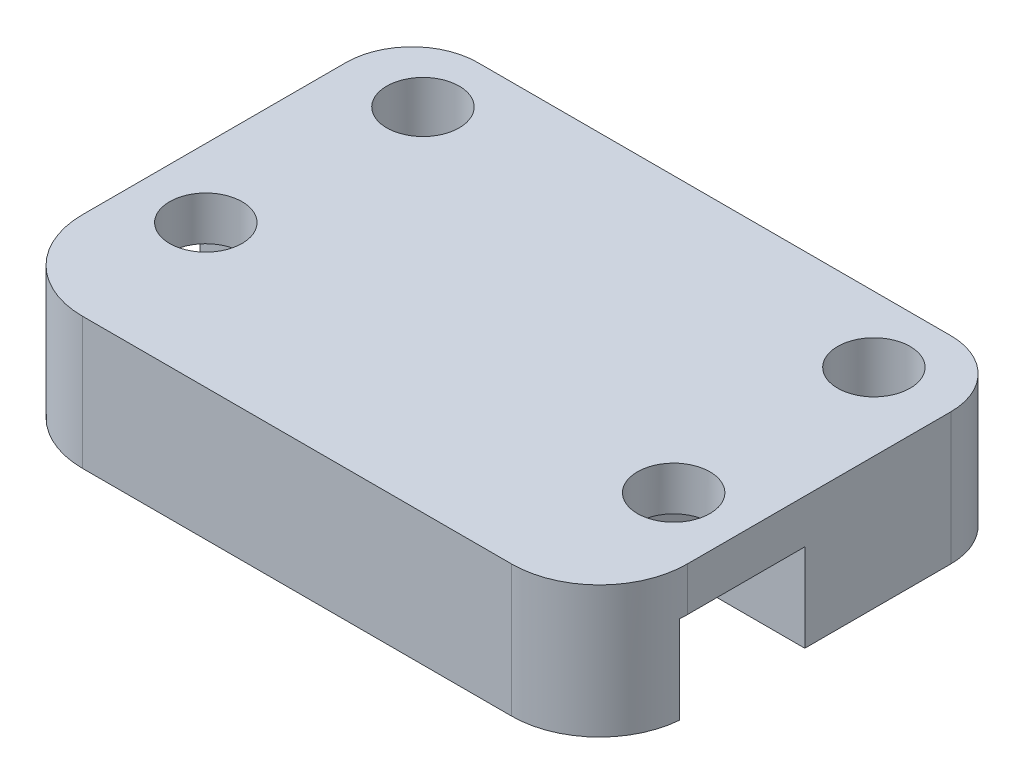
ISO-10303-21;
HEADER;
FILE_DESCRIPTION(('STEP AP214'),'2;1');
FILE_NAME('part.step','',(''),(''),'','','');
FILE_SCHEMA(('AUTOMOTIVE_DESIGN { 1 0 10303 214 1 1 1 1 }'));
ENDSEC;
DATA;
#1=APPLICATION_CONTEXT('core data for automotive mechanical design processes');
#2=APPLICATION_PROTOCOL_DEFINITION('international standard','automotive_design',2000,#1);
#3=PRODUCT_CONTEXT('',#1,'mechanical');
#4=PRODUCT('Part','Part','',(#3));
#5=PRODUCT_RELATED_PRODUCT_CATEGORY('part','',(#4));
#6=PRODUCT_DEFINITION_FORMATION('','',#4);
#7=PRODUCT_DEFINITION_CONTEXT('part definition',#1,'design');
#8=PRODUCT_DEFINITION('design','',#6,#7);
#9=PRODUCT_DEFINITION_SHAPE('','',#8);
#10=(LENGTH_UNIT() NAMED_UNIT(*) SI_UNIT(.MILLI.,.METRE.));
#11=(NAMED_UNIT(*) PLANE_ANGLE_UNIT() SI_UNIT($,.RADIAN.));
#12=(NAMED_UNIT(*) SI_UNIT($,.STERADIAN.) SOLID_ANGLE_UNIT());
#13=UNCERTAINTY_MEASURE_WITH_UNIT(LENGTH_MEASURE(1.E-05),#10,'distance_accuracy_value','');
#14=(GEOMETRIC_REPRESENTATION_CONTEXT(3) GLOBAL_UNCERTAINTY_ASSIGNED_CONTEXT((#13)) GLOBAL_UNIT_ASSIGNED_CONTEXT((#10,
#11,#12)) REPRESENTATION_CONTEXT('',''));
#15=CARTESIAN_POINT('',(0.,0.,0.));
#16=DIRECTION('',(0.,0.,1.));
#17=DIRECTION('',(1.,0.,0.));
#18=AXIS2_PLACEMENT_3D('',#15,#16,#17);
#19=CARTESIAN_POINT('',(10.65,-3.,6.5));
#20=DIRECTION('',(0.,1.,0.));
#21=DIRECTION('',(0.,0.,1.));
#22=AXIS2_PLACEMENT_3D('',#19,#20,#21);
#23=CYLINDRICAL_SURFACE('',#22,1.65);
#24=CARTESIAN_POINT('',(10.65,3.,6.5));
#25=DIRECTION('',(0.,1.,0.));
#26=DIRECTION('',(0.,0.,1.));
#27=AXIS2_PLACEMENT_3D('',#24,#25,#26);
#28=CIRCLE('',#27,1.65);
#29=CARTESIAN_POINT('',(10.65,3.,8.15));
#30=VERTEX_POINT('',#29);
#31=EDGE_CURVE('E294',#30,#30,#28,.T.);
#32=ORIENTED_EDGE('',*,*,#31,.T.);
#33=EDGE_LOOP('',(#32));
#34=FACE_BOUND('',#33,.T.);
#35=CARTESIAN_POINT('',(10.65,1.,6.5));
#36=DIRECTION('',(0.,-1.,0.));
#37=DIRECTION('',(0.,0.,-1.));
#38=AXIS2_PLACEMENT_3D('',#35,#36,#37);
#39=CIRCLE('',#38,1.65);
#40=CARTESIAN_POINT('',(10.65,1.,4.85));
#41=VERTEX_POINT('',#40);
#42=EDGE_CURVE('E266',#41,#41,#39,.F.);
#43=ORIENTED_EDGE('',*,*,#42,.F.);
#44=EDGE_LOOP('',(#43));
#45=FACE_BOUND('',#44,.T.);
#46=ADVANCED_FACE('F43',(#34,#45),#23,.F.);
#47=CARTESIAN_POINT('',(0.,-3.,13.));
#48=DIRECTION('',(0.,1.,0.));
#49=DIRECTION('',(0.,0.,1.));
#50=AXIS2_PLACEMENT_3D('',#47,#48,#49);
#51=PLANE('',#50);
#52=CARTESIAN_POINT('',(10.265,-3.,-3.00000000000006));
#53=DIRECTION('',(0.,1.,0.));
#54=DIRECTION('',(0.,0.,1.));
#55=AXIS2_PLACEMENT_3D('',#52,#53,#54);
#56=CIRCLE('',#55,1.65);
#57=CARTESIAN_POINT('',(10.265,-3.,-1.35000000000006));
#58=VERTEX_POINT('',#57);
#59=EDGE_CURVE('E282',#58,#58,#56,.T.);
#60=ORIENTED_EDGE('',*,*,#59,.T.);
#61=EDGE_LOOP('',(#60));
#62=FACE_BOUND('',#61,.T.);
#63=CARTESIAN_POINT('',(-10.265,-3.,-3.00000000000006));
#64=DIRECTION('',(0.,1.,0.));
#65=DIRECTION('',(0.,0.,1.));
#66=AXIS2_PLACEMENT_3D('',#63,#64,#65);
#67=CIRCLE('',#66,1.65);
#68=CARTESIAN_POINT('',(-10.265,-3.,-1.35000000000006));
#69=VERTEX_POINT('',#68);
#70=EDGE_CURVE('E275',#69,#69,#67,.T.);
#71=ORIENTED_EDGE('',*,*,#70,.T.);
#72=EDGE_LOOP('',(#71));
#73=FACE_BOUND('',#72,.T.);
#74=CARTESIAN_POINT('',(-9.77,-3.,9.));
#75=DIRECTION('',(0.,1.,0.));
#76=DIRECTION('',(0.,0.,1.));
#77=AXIS2_PLACEMENT_3D('',#74,#75,#76);
#78=CIRCLE('',#77,4.);
#79=CARTESIAN_POINT('',(-9.77,-3.,13.));
#80=VERTEX_POINT('',#79);
#81=CARTESIAN_POINT('',(-13.7546580781794,-3.,9.35));
#82=VERTEX_POINT('',#81);
#83=EDGE_CURVE('E341',#80,#82,#78,.F.);
#84=ORIENTED_EDGE('',*,*,#83,.T.);
#85=DIRECTION('',(-1.,0.,0.));
#86=VECTOR('',#85,1.);
#87=CARTESIAN_POINT('',(-12.2954482671904,-3.,9.35));
#88=LINE('',#87,#86);
#89=CARTESIAN_POINT('',(-9.00455173280957,-3.,9.35));
#90=VERTEX_POINT('',#89);
#91=EDGE_CURVE('E181',#90,#82,#88,.T.);
#92=ORIENTED_EDGE('',*,*,#91,.F.);
#93=DIRECTION('',(-0.5,0.,0.866025403784439));
#94=VECTOR('',#93,1.);
#95=CARTESIAN_POINT('',(-7.35910346561913,-3.,6.5));
#96=LINE('',#95,#94);
#97=CARTESIAN_POINT('',(-7.35910346561913,-3.,6.5));
#98=VERTEX_POINT('',#97);
#99=EDGE_CURVE('E210',#98,#90,#96,.T.);
#100=ORIENTED_EDGE('',*,*,#99,.F.);
#101=DIRECTION('',(0.5,0.,0.866025403784439));
#102=VECTOR('',#101,1.);
#103=CARTESIAN_POINT('',(-9.00455173280957,-3.,3.65));
#104=LINE('',#103,#102);
#105=CARTESIAN_POINT('',(-9.00455173280957,-3.,3.65));
#106=VERTEX_POINT('',#105);
#107=EDGE_CURVE('E206',#106,#98,#104,.T.);
#108=ORIENTED_EDGE('',*,*,#107,.F.);
#109=DIRECTION('',(1.,0.,0.));
#110=VECTOR('',#109,1.);
#111=CARTESIAN_POINT('',(-12.2954482671904,-3.,3.65));
#112=LINE('',#111,#110);
#113=CARTESIAN_POINT('',(-13.77,-3.,3.65));
#114=VERTEX_POINT('',#113);
#115=EDGE_CURVE('E187',#114,#106,#112,.T.);
#116=ORIENTED_EDGE('',*,*,#115,.F.);
#117=DIRECTION('',(0.,0.,-1.));
#118=VECTOR('',#117,1.);
#119=CARTESIAN_POINT('',(-13.77,-3.,13.));
#120=LINE('',#119,#118);
#121=CARTESIAN_POINT('',(-13.77,-3.,-2.99999999999999));
#122=VERTEX_POINT('',#121);
#123=EDGE_CURVE('E310',#114,#122,#120,.T.);
#124=ORIENTED_EDGE('',*,*,#123,.T.);
#125=CARTESIAN_POINT('',(-10.77,-3.,-3.));
#126=DIRECTION('',(0.,1.,0.));
#127=DIRECTION('',(0.,0.,1.));
#128=AXIS2_PLACEMENT_3D('',#125,#126,#127);
#129=CIRCLE('',#128,3.);
#130=CARTESIAN_POINT('',(-10.77,-3.,-6.));
#131=VERTEX_POINT('',#130);
#132=EDGE_CURVE('E359',#122,#131,#129,.F.);
#133=ORIENTED_EDGE('',*,*,#132,.T.);
#134=DIRECTION('',(-1.,0.,0.));
#135=VECTOR('',#134,1.);
#136=CARTESIAN_POINT('',(13.77,-3.,-6.));
#137=LINE('',#136,#135);
#138=CARTESIAN_POINT('',(10.77,-3.,-6.));
#139=VERTEX_POINT('',#138);
#140=EDGE_CURVE('E286',#139,#131,#137,.T.);
#141=ORIENTED_EDGE('',*,*,#140,.F.);
#142=CARTESIAN_POINT('',(10.77,-3.,-3.));
#143=DIRECTION('',(0.,1.,0.));
#144=DIRECTION('',(0.,0.,1.));
#145=AXIS2_PLACEMENT_3D('',#142,#143,#144);
#146=CIRCLE('',#145,3.);
#147=CARTESIAN_POINT('',(13.77,-3.,-2.99999999999999));
#148=VERTEX_POINT('',#147);
#149=EDGE_CURVE('E362',#139,#148,#146,.F.);
#150=ORIENTED_EDGE('',*,*,#149,.T.);
#151=DIRECTION('',(0.,0.,-1.));
#152=VECTOR('',#151,1.);
#153=CARTESIAN_POINT('',(13.77,-3.,13.));
#154=LINE('',#153,#152);
#155=CARTESIAN_POINT('',(13.77,-3.,3.65));
#156=VERTEX_POINT('',#155);
#157=EDGE_CURVE('E321',#156,#148,#154,.T.);
#158=ORIENTED_EDGE('',*,*,#157,.F.);
#159=DIRECTION('',(1.,0.,0.));
#160=VECTOR('',#159,1.);
#161=CARTESIAN_POINT('',(9.00455173280957,-3.,3.65));
#162=LINE('',#161,#160);
#163=CARTESIAN_POINT('',(9.00455173280957,-3.,3.65));
#164=VERTEX_POINT('',#163);
#165=EDGE_CURVE('E225',#164,#156,#162,.T.);
#166=ORIENTED_EDGE('',*,*,#165,.F.);
#167=DIRECTION('',(0.5,0.,-0.866025403784439));
#168=VECTOR('',#167,1.);
#169=CARTESIAN_POINT('',(7.35910346561913,-3.,6.5));
#170=LINE('',#169,#168);
#171=CARTESIAN_POINT('',(7.35910346561913,-3.,6.5));
#172=VERTEX_POINT('',#171);
#173=EDGE_CURVE('E244',#172,#164,#170,.T.);
#174=ORIENTED_EDGE('',*,*,#173,.F.);
#175=DIRECTION('',(-0.5,0.,-0.866025403784439));
#176=VECTOR('',#175,1.);
#177=CARTESIAN_POINT('',(9.00455173280957,-3.,9.35));
#178=LINE('',#177,#176);
#179=CARTESIAN_POINT('',(9.00455173280957,-3.,9.35));
#180=VERTEX_POINT('',#179);
#181=EDGE_CURVE('E240',#180,#172,#178,.T.);
#182=ORIENTED_EDGE('',*,*,#181,.F.);
#183=DIRECTION('',(-1.,0.,0.));
#184=VECTOR('',#183,1.);
#185=CARTESIAN_POINT('',(12.2954482671904,-3.,9.35));
#186=LINE('',#185,#184);
#187=CARTESIAN_POINT('',(13.7546580781794,-3.,9.35));
#188=VERTEX_POINT('',#187);
#189=EDGE_CURVE('E237',#188,#180,#186,.T.);
#190=ORIENTED_EDGE('',*,*,#189,.F.);
#191=CARTESIAN_POINT('',(9.77,-3.,9.));
#192=DIRECTION('',(0.,1.,0.));
#193=DIRECTION('',(0.,0.,1.));
#194=AXIS2_PLACEMENT_3D('',#191,#192,#193);
#195=CIRCLE('',#194,4.);
#196=CARTESIAN_POINT('',(9.77,-3.,13.));
#197=VERTEX_POINT('',#196);
#198=EDGE_CURVE('E345',#188,#197,#195,.F.);
#199=ORIENTED_EDGE('',*,*,#198,.T.);
#200=DIRECTION('',(1.,0.,0.));
#201=VECTOR('',#200,1.);
#202=CARTESIAN_POINT('',(0.,-3.,13.));
#203=LINE('',#202,#201);
#204=EDGE_CURVE('E299',#80,#197,#203,.T.);
#205=ORIENTED_EDGE('',*,*,#204,.F.);
#206=EDGE_LOOP('',(#84,#92,#100,#108,#116,#124,#133,#141,#150,#158,#166,#174,#182,#190,#199,#205));
#207=FACE_BOUND('',#206,.T.);
#208=ADVANCED_FACE('F394',(#62,#73,#207),#51,.F.);
#209=CARTESIAN_POINT('',(13.77,0.,13.));
#210=DIRECTION('',(-1.,0.,0.));
#211=DIRECTION('',(0.,0.,1.));
#212=AXIS2_PLACEMENT_3D('',#209,#210,#211);
#213=PLANE('',#212);
#214=DIRECTION('',(0.,0.,1.));
#215=VECTOR('',#214,1.);
#216=CARTESIAN_POINT('',(13.77,1.,13.));
#217=LINE('',#216,#215);
#218=CARTESIAN_POINT('',(13.77,1.,3.65));
#219=VERTEX_POINT('',#218);
#220=CARTESIAN_POINT('',(13.77,1.,9.));
#221=VERTEX_POINT('',#220);
#222=EDGE_CURVE('E59',#219,#221,#217,.T.);
#223=ORIENTED_EDGE('',*,*,#222,.F.);
#224=DIRECTION('',(0.,-1.,0.));
#225=VECTOR('',#224,1.);
#226=CARTESIAN_POINT('',(13.77,0.,3.65));
#227=LINE('',#226,#225);
#228=EDGE_CURVE('E11',#219,#156,#227,.T.);
#229=ORIENTED_EDGE('',*,*,#228,.T.);
#230=ORIENTED_EDGE('',*,*,#157,.T.);
#231=DIRECTION('',(0.,-1.,0.));
#232=VECTOR('',#231,1.);
#233=CARTESIAN_POINT('',(13.77,3.,-3.));
#234=LINE('',#233,#232);
#235=CARTESIAN_POINT('',(13.77,3.,-2.99999999999999));
#236=VERTEX_POINT('',#235);
#237=EDGE_CURVE('E366',#148,#236,#234,.F.);
#238=ORIENTED_EDGE('',*,*,#237,.T.);
#239=DIRECTION('',(0.,0.,-1.));
#240=VECTOR('',#239,1.);
#241=CARTESIAN_POINT('',(13.77,3.,13.));
#242=LINE('',#241,#240);
#243=CARTESIAN_POINT('',(13.77,3.,9.));
#244=VERTEX_POINT('',#243);
#245=EDGE_CURVE('E317',#244,#236,#242,.T.);
#246=ORIENTED_EDGE('',*,*,#245,.F.);
#247=DIRECTION('',(0.,1.,0.));
#248=VECTOR('',#247,1.);
#249=CARTESIAN_POINT('',(13.77,-3.,9.));
#250=LINE('',#249,#248);
#251=EDGE_CURVE('E337',#244,#221,#250,.F.);
#252=ORIENTED_EDGE('',*,*,#251,.T.);
#253=EDGE_LOOP('',(#223,#229,#230,#238,#246,#252));
#254=FACE_BOUND('',#253,.T.);
#255=ADVANCED_FACE('F415',(#254),#213,.F.);
#256=CARTESIAN_POINT('',(0.,3.,13.));
#257=DIRECTION('',(0.,1.,0.));
#258=DIRECTION('',(0.,0.,1.));
#259=AXIS2_PLACEMENT_3D('',#256,#257,#258);
#260=PLANE('',#259);
#261=CARTESIAN_POINT('',(10.265,3.,-3.00000000000006));
#262=DIRECTION('',(0.,-1.,0.));
#263=DIRECTION('',(0.,0.,-1.));
#264=AXIS2_PLACEMENT_3D('',#261,#262,#263);
#265=CIRCLE('',#264,1.65);
#266=CARTESIAN_POINT('',(10.265,3.,-4.65000000000007));
#267=VERTEX_POINT('',#266);
#268=EDGE_CURVE('E271',#267,#267,#265,.T.);
#269=ORIENTED_EDGE('',*,*,#268,.T.);
#270=EDGE_LOOP('',(#269));
#271=FACE_BOUND('',#270,.T.);
#272=CARTESIAN_POINT('',(-10.265,3.,-3.00000000000006));
#273=DIRECTION('',(0.,-1.,0.));
#274=DIRECTION('',(0.,0.,-1.));
#275=AXIS2_PLACEMENT_3D('',#272,#273,#274);
#276=CIRCLE('',#275,1.65);
#277=CARTESIAN_POINT('',(-10.265,3.,-4.65000000000007));
#278=VERTEX_POINT('',#277);
#279=EDGE_CURVE('E270',#278,#278,#276,.T.);
#280=ORIENTED_EDGE('',*,*,#279,.T.);
#281=EDGE_LOOP('',(#280));
#282=FACE_BOUND('',#281,.T.);
#283=CARTESIAN_POINT('',(-10.65,3.,6.5));
#284=DIRECTION('',(0.,1.,0.));
#285=DIRECTION('',(0.,0.,1.));
#286=AXIS2_PLACEMENT_3D('',#283,#284,#285);
#287=CIRCLE('',#286,1.65);
#288=CARTESIAN_POINT('',(-10.65,3.,8.15));
#289=VERTEX_POINT('',#288);
#290=EDGE_CURVE('E295',#289,#289,#287,.T.);
#291=ORIENTED_EDGE('',*,*,#290,.F.);
#292=EDGE_LOOP('',(#291));
#293=FACE_BOUND('',#292,.T.);
#294=ORIENTED_EDGE('',*,*,#31,.F.);
#295=EDGE_LOOP('',(#294));
#296=FACE_BOUND('',#295,.T.);
#297=ORIENTED_EDGE('',*,*,#245,.T.);
#298=CARTESIAN_POINT('',(10.77,3.,-3.));
#299=DIRECTION('',(0.,1.,0.));
#300=DIRECTION('',(0.,0.,1.));
#301=AXIS2_PLACEMENT_3D('',#298,#299,#300);
#302=CIRCLE('',#301,3.);
#303=CARTESIAN_POINT('',(10.77,3.,-6.));
#304=VERTEX_POINT('',#303);
#305=EDGE_CURVE('E372',#236,#304,#302,.T.);
#306=ORIENTED_EDGE('',*,*,#305,.T.);
#307=DIRECTION('',(1.,0.,0.));
#308=VECTOR('',#307,1.);
#309=CARTESIAN_POINT('',(-13.77,3.,-6.));
#310=LINE('',#309,#308);
#311=CARTESIAN_POINT('',(-10.77,3.,-6.));
#312=VERTEX_POINT('',#311);
#313=EDGE_CURVE('E290',#312,#304,#310,.T.);
#314=ORIENTED_EDGE('',*,*,#313,.F.);
#315=CARTESIAN_POINT('',(-10.77,3.,-3.));
#316=DIRECTION('',(0.,1.,0.));
#317=DIRECTION('',(0.,0.,1.));
#318=AXIS2_PLACEMENT_3D('',#315,#316,#317);
#319=CIRCLE('',#318,3.);
#320=CARTESIAN_POINT('',(-13.77,3.,-2.99999999999999));
#321=VERTEX_POINT('',#320);
#322=EDGE_CURVE('E369',#312,#321,#319,.T.);
#323=ORIENTED_EDGE('',*,*,#322,.T.);
#324=DIRECTION('',(0.,0.,-1.));
#325=VECTOR('',#324,1.);
#326=CARTESIAN_POINT('',(-13.77,3.,13.));
#327=LINE('',#326,#325);
#328=CARTESIAN_POINT('',(-13.77,3.,9.));
#329=VERTEX_POINT('',#328);
#330=EDGE_CURVE('E313',#329,#321,#327,.T.);
#331=ORIENTED_EDGE('',*,*,#330,.F.);
#332=CARTESIAN_POINT('',(-9.77,3.,9.));
#333=DIRECTION('',(0.,1.,0.));
#334=DIRECTION('',(0.,0.,1.));
#335=AXIS2_PLACEMENT_3D('',#332,#333,#334);
#336=CIRCLE('',#335,4.);
#337=CARTESIAN_POINT('',(-9.77,3.,13.));
#338=VERTEX_POINT('',#337);
#339=EDGE_CURVE('E331',#329,#338,#336,.T.);
#340=ORIENTED_EDGE('',*,*,#339,.T.);
#341=DIRECTION('',(1.,0.,0.));
#342=VECTOR('',#341,1.);
#343=CARTESIAN_POINT('',(0.,3.,13.));
#344=LINE('',#343,#342);
#345=CARTESIAN_POINT('',(9.77,3.,13.));
#346=VERTEX_POINT('',#345);
#347=EDGE_CURVE('E306',#338,#346,#344,.T.);
#348=ORIENTED_EDGE('',*,*,#347,.T.);
#349=CARTESIAN_POINT('',(9.77,3.,9.));
#350=DIRECTION('',(0.,1.,0.));
#351=DIRECTION('',(0.,0.,1.));
#352=AXIS2_PLACEMENT_3D('',#349,#350,#351);
#353=CIRCLE('',#352,4.);
#354=EDGE_CURVE('E334',#346,#244,#353,.T.);
#355=ORIENTED_EDGE('',*,*,#354,.T.);
#356=EDGE_LOOP('',(#297,#306,#314,#323,#331,#340,#348,#355));
#357=FACE_BOUND('',#356,.T.);
#358=ADVANCED_FACE('F482',(#271,#282,#293,#296,#357),#260,.T.);
#359=CARTESIAN_POINT('',(-13.77,0.,13.));
#360=DIRECTION('',(-1.,0.,0.));
#361=DIRECTION('',(0.,0.,1.));
#362=AXIS2_PLACEMENT_3D('',#359,#360,#361);
#363=PLANE('',#362);
#364=DIRECTION('',(0.,-1.,0.));
#365=VECTOR('',#364,1.);
#366=CARTESIAN_POINT('',(-13.77,0.,3.65));
#367=LINE('',#366,#365);
#368=CARTESIAN_POINT('',(-13.77,1.,3.65));
#369=VERTEX_POINT('',#368);
#370=EDGE_CURVE('E52',#369,#114,#367,.T.);
#371=ORIENTED_EDGE('',*,*,#370,.F.);
#372=DIRECTION('',(0.,0.,-1.));
#373=VECTOR('',#372,1.);
#374=CARTESIAN_POINT('',(-13.77,1.,13.));
#375=LINE('',#374,#373);
#376=CARTESIAN_POINT('',(-13.77,1.,9.));
#377=VERTEX_POINT('',#376);
#378=EDGE_CURVE('E177',#377,#369,#375,.T.);
#379=ORIENTED_EDGE('',*,*,#378,.F.);
#380=DIRECTION('',(0.,1.,0.));
#381=VECTOR('',#380,1.);
#382=CARTESIAN_POINT('',(-13.77,0.,9.));
#383=LINE('',#382,#381);
#384=EDGE_CURVE('E348',#377,#329,#383,.T.);
#385=ORIENTED_EDGE('',*,*,#384,.T.);
#386=ORIENTED_EDGE('',*,*,#330,.T.);
#387=DIRECTION('',(0.,1.,0.));
#388=VECTOR('',#387,1.);
#389=CARTESIAN_POINT('',(-13.77,0.,-3.));
#390=LINE('',#389,#388);
#391=EDGE_CURVE('E375',#321,#122,#390,.F.);
#392=ORIENTED_EDGE('',*,*,#391,.T.);
#393=ORIENTED_EDGE('',*,*,#123,.F.);
#394=EDGE_LOOP('',(#371,#379,#385,#386,#392,#393));
#395=FACE_BOUND('',#394,.T.);
#396=ADVANCED_FACE('F396',(#395),#363,.T.);
#397=CARTESIAN_POINT('',(0.,0.,13.));
#398=DIRECTION('',(0.,0.,1.));
#399=DIRECTION('',(1.,0.,0.));
#400=AXIS2_PLACEMENT_3D('',#397,#398,#399);
#401=PLANE('',#400);
#402=ORIENTED_EDGE('',*,*,#204,.T.);
#403=DIRECTION('',(0.,1.,0.));
#404=VECTOR('',#403,1.);
#405=CARTESIAN_POINT('',(9.77,3.,13.));
#406=LINE('',#405,#404);
#407=EDGE_CURVE('E327',#197,#346,#406,.T.);
#408=ORIENTED_EDGE('',*,*,#407,.T.);
#409=ORIENTED_EDGE('',*,*,#347,.F.);
#410=DIRECTION('',(0.,1.,0.));
#411=VECTOR('',#410,1.);
#412=CARTESIAN_POINT('',(-9.77,0.,13.));
#413=LINE('',#412,#411);
#414=EDGE_CURVE('E324',#338,#80,#413,.F.);
#415=ORIENTED_EDGE('',*,*,#414,.T.);
#416=EDGE_LOOP('',(#402,#408,#409,#415));
#417=FACE_BOUND('',#416,.T.);
#418=ADVANCED_FACE('F443',(#417),#401,.T.);
#419=CARTESIAN_POINT('',(-10.65,-3.,6.5));
#420=DIRECTION('',(0.,1.,0.));
#421=DIRECTION('',(0.,0.,1.));
#422=AXIS2_PLACEMENT_3D('',#419,#420,#421);
#423=CYLINDRICAL_SURFACE('',#422,1.65);
#424=CARTESIAN_POINT('',(-10.65,1.,6.5));
#425=DIRECTION('',(0.,1.,0.));
#426=DIRECTION('',(0.,0.,1.));
#427=AXIS2_PLACEMENT_3D('',#424,#425,#426);
#428=CIRCLE('',#427,1.65);
#429=CARTESIAN_POINT('',(-10.65,1.,8.15));
#430=VERTEX_POINT('',#429);
#431=EDGE_CURVE('E260',#430,#430,#428,.F.);
#432=ORIENTED_EDGE('',*,*,#431,.T.);
#433=EDGE_LOOP('',(#432));
#434=FACE_BOUND('',#433,.T.);
#435=ORIENTED_EDGE('',*,*,#290,.T.);
#436=EDGE_LOOP('',(#435));
#437=FACE_BOUND('',#436,.T.);
#438=ADVANCED_FACE('F476',(#434,#437),#423,.F.);
#439=CARTESIAN_POINT('',(0.,0.,-6.));
#440=DIRECTION('',(0.,0.,-1.));
#441=DIRECTION('',(-1.,0.,0.));
#442=AXIS2_PLACEMENT_3D('',#439,#440,#441);
#443=PLANE('',#442);
#444=ORIENTED_EDGE('',*,*,#313,.T.);
#445=DIRECTION('',(0.,-1.,0.));
#446=VECTOR('',#445,1.);
#447=CARTESIAN_POINT('',(10.77,-3.,-6.));
#448=LINE('',#447,#446);
#449=EDGE_CURVE('E355',#304,#139,#448,.T.);
#450=ORIENTED_EDGE('',*,*,#449,.T.);
#451=ORIENTED_EDGE('',*,*,#140,.T.);
#452=DIRECTION('',(0.,1.,0.));
#453=VECTOR('',#452,1.);
#454=CARTESIAN_POINT('',(-10.77,0.,-6.));
#455=LINE('',#454,#453);
#456=EDGE_CURVE('E351',#131,#312,#455,.T.);
#457=ORIENTED_EDGE('',*,*,#456,.T.);
#458=EDGE_LOOP('',(#444,#450,#451,#457));
#459=FACE_BOUND('',#458,.T.);
#460=ADVANCED_FACE('F404',(#459),#443,.T.);
#461=CARTESIAN_POINT('',(9.77,0.,9.));
#462=DIRECTION('',(0.,-1.,0.));
#463=DIRECTION('',(0.,0.,-1.));
#464=AXIS2_PLACEMENT_3D('',#461,#462,#463);
#465=CYLINDRICAL_SURFACE('',#464,4.);
#466=DIRECTION('',(0.,-1.,0.));
#467=VECTOR('',#466,1.);
#468=CARTESIAN_POINT('',(13.7546580781794,0.,9.35));
#469=LINE('',#468,#467);
#470=CARTESIAN_POINT('',(13.7546580781794,1.,9.35));
#471=VERTEX_POINT('',#470);
#472=EDGE_CURVE('E388',#471,#188,#469,.T.);
#473=ORIENTED_EDGE('',*,*,#472,.F.);
#474=CARTESIAN_POINT('',(9.77,1.,9.));
#475=DIRECTION('',(0.,-1.,0.));
#476=DIRECTION('',(0.,0.,-1.));
#477=AXIS2_PLACEMENT_3D('',#474,#475,#476);
#478=CIRCLE('',#477,4.);
#479=EDGE_CURVE('E385',#471,#221,#478,.F.);
#480=ORIENTED_EDGE('',*,*,#479,.T.);
#481=ORIENTED_EDGE('',*,*,#251,.F.);
#482=ORIENTED_EDGE('',*,*,#354,.F.);
#483=ORIENTED_EDGE('',*,*,#407,.F.);
#484=ORIENTED_EDGE('',*,*,#198,.F.);
#485=EDGE_LOOP('',(#473,#480,#481,#482,#483,#484));
#486=FACE_BOUND('',#485,.T.);
#487=ADVANCED_FACE('F437',(#486),#465,.T.);
#488=CARTESIAN_POINT('',(-9.77,0.,9.));
#489=DIRECTION('',(0.,1.,0.));
#490=DIRECTION('',(0.,0.,1.));
#491=AXIS2_PLACEMENT_3D('',#488,#489,#490);
#492=CYLINDRICAL_SURFACE('',#491,4.);
#493=DIRECTION('',(0.,1.,0.));
#494=VECTOR('',#493,1.);
#495=CARTESIAN_POINT('',(-13.7546580781794,0.,9.35));
#496=LINE('',#495,#494);
#497=CARTESIAN_POINT('',(-13.7546580781794,1.,9.35));
#498=VERTEX_POINT('',#497);
#499=EDGE_CURVE('E382',#82,#498,#496,.T.);
#500=ORIENTED_EDGE('',*,*,#499,.F.);
#501=ORIENTED_EDGE('',*,*,#83,.F.);
#502=ORIENTED_EDGE('',*,*,#414,.F.);
#503=ORIENTED_EDGE('',*,*,#339,.F.);
#504=ORIENTED_EDGE('',*,*,#384,.F.);
#505=CARTESIAN_POINT('',(-9.77,1.,9.));
#506=DIRECTION('',(0.,1.,0.));
#507=DIRECTION('',(0.,0.,1.));
#508=AXIS2_PLACEMENT_3D('',#505,#506,#507);
#509=CIRCLE('',#508,4.);
#510=EDGE_CURVE('E379',#498,#377,#509,.F.);
#511=ORIENTED_EDGE('',*,*,#510,.F.);
#512=EDGE_LOOP('',(#500,#501,#502,#503,#504,#511));
#513=FACE_BOUND('',#512,.T.);
#514=ADVANCED_FACE('F449',(#513),#492,.T.);
#515=CARTESIAN_POINT('',(10.77,0.,-3.));
#516=DIRECTION('',(0.,1.,0.));
#517=DIRECTION('',(0.,0.,1.));
#518=AXIS2_PLACEMENT_3D('',#515,#516,#517);
#519=CYLINDRICAL_SURFACE('',#518,3.);
#520=ORIENTED_EDGE('',*,*,#305,.F.);
#521=ORIENTED_EDGE('',*,*,#237,.F.);
#522=ORIENTED_EDGE('',*,*,#149,.F.);
#523=ORIENTED_EDGE('',*,*,#449,.F.);
#524=EDGE_LOOP('',(#520,#521,#522,#523));
#525=FACE_BOUND('',#524,.T.);
#526=ADVANCED_FACE('F409',(#525),#519,.T.);
#527=CARTESIAN_POINT('',(-10.77,0.,-3.));
#528=DIRECTION('',(0.,1.,0.));
#529=DIRECTION('',(0.,0.,1.));
#530=AXIS2_PLACEMENT_3D('',#527,#528,#529);
#531=CYLINDRICAL_SURFACE('',#530,3.);
#532=ORIENTED_EDGE('',*,*,#132,.F.);
#533=ORIENTED_EDGE('',*,*,#391,.F.);
#534=ORIENTED_EDGE('',*,*,#322,.F.);
#535=ORIENTED_EDGE('',*,*,#456,.F.);
#536=EDGE_LOOP('',(#532,#533,#534,#535));
#537=FACE_BOUND('',#536,.T.);
#538=ADVANCED_FACE('F45',(#537),#531,.T.);
#539=CARTESIAN_POINT('',(-10.265,3.,-3.00000000000006));
#540=DIRECTION('',(0.,-1.,0.));
#541=DIRECTION('',(0.,0.,-1.));
#542=AXIS2_PLACEMENT_3D('',#539,#540,#541);
#543=CYLINDRICAL_SURFACE('',#542,1.65);
#544=ORIENTED_EDGE('',*,*,#279,.F.);
#545=EDGE_LOOP('',(#544));
#546=FACE_BOUND('',#545,.T.);
#547=ORIENTED_EDGE('',*,*,#70,.F.);
#548=EDGE_LOOP('',(#547));
#549=FACE_BOUND('',#548,.T.);
#550=ADVANCED_FACE('F495',(#546,#549),#543,.F.);
#551=CARTESIAN_POINT('',(10.265,3.,-3.00000000000006));
#552=DIRECTION('',(0.,-1.,0.));
#553=DIRECTION('',(0.,0.,-1.));
#554=AXIS2_PLACEMENT_3D('',#551,#552,#553);
#555=CYLINDRICAL_SURFACE('',#554,1.65);
#556=ORIENTED_EDGE('',*,*,#268,.F.);
#557=EDGE_LOOP('',(#556));
#558=FACE_BOUND('',#557,.T.);
#559=ORIENTED_EDGE('',*,*,#59,.F.);
#560=EDGE_LOOP('',(#559));
#561=FACE_BOUND('',#560,.T.);
#562=ADVANCED_FACE('F499',(#558,#561),#555,.F.);
#563=CARTESIAN_POINT('',(0.,1.,0.));
#564=DIRECTION('',(0.,1.,0.));
#565=DIRECTION('',(0.,0.,1.));
#566=AXIS2_PLACEMENT_3D('',#563,#564,#565);
#567=PLANE('',#566);
#568=ORIENTED_EDGE('',*,*,#378,.T.);
#569=DIRECTION('',(1.,0.,0.));
#570=VECTOR('',#569,1.);
#571=CARTESIAN_POINT('',(-15.2954482671904,1.,3.65));
#572=LINE('',#571,#570);
#573=CARTESIAN_POINT('',(-9.00455173280957,1.,3.65));
#574=VERTEX_POINT('',#573);
#575=EDGE_CURVE('E170',#369,#574,#572,.T.);
#576=ORIENTED_EDGE('',*,*,#575,.T.);
#577=DIRECTION('',(0.5,0.,0.866025403784439));
#578=VECTOR('',#577,1.);
#579=CARTESIAN_POINT('',(-9.00455173280957,1.,3.65));
#580=LINE('',#579,#578);
#581=CARTESIAN_POINT('',(-7.35910346561913,1.,6.5));
#582=VERTEX_POINT('',#581);
#583=EDGE_CURVE('E175',#574,#582,#580,.T.);
#584=ORIENTED_EDGE('',*,*,#583,.T.);
#585=DIRECTION('',(-0.5,0.,0.866025403784439));
#586=VECTOR('',#585,1.);
#587=CARTESIAN_POINT('',(-7.35910346561913,1.,6.5));
#588=LINE('',#587,#586);
#589=CARTESIAN_POINT('',(-9.00455173280957,1.,9.35));
#590=VERTEX_POINT('',#589);
#591=EDGE_CURVE('E197',#582,#590,#588,.T.);
#592=ORIENTED_EDGE('',*,*,#591,.T.);
#593=DIRECTION('',(-1.,0.,0.));
#594=VECTOR('',#593,1.);
#595=CARTESIAN_POINT('',(-9.00455173280957,1.,9.35));
#596=LINE('',#595,#594);
#597=EDGE_CURVE('E67',#590,#498,#596,.T.);
#598=ORIENTED_EDGE('',*,*,#597,.T.);
#599=ORIENTED_EDGE('',*,*,#510,.T.);
#600=EDGE_LOOP('',(#568,#576,#584,#592,#598,#599));
#601=FACE_BOUND('',#600,.T.);
#602=ORIENTED_EDGE('',*,*,#431,.F.);
#603=EDGE_LOOP('',(#602));
#604=FACE_BOUND('',#603,.T.);
#605=ADVANCED_FACE('F172',(#601,#604),#567,.F.);
#606=CARTESIAN_POINT('',(-12.2954482671904,1.,9.35));
#607=DIRECTION('',(0.,0.,1.));
#608=DIRECTION('',(1.,0.,0.));
#609=AXIS2_PLACEMENT_3D('',#606,#607,#608);
#610=PLANE('',#609);
#611=ORIENTED_EDGE('',*,*,#499,.T.);
#612=ORIENTED_EDGE('',*,*,#597,.F.);
#613=DIRECTION('',(0.,-1.,0.));
#614=VECTOR('',#613,1.);
#615=CARTESIAN_POINT('',(-9.00455173280957,1.,9.35));
#616=LINE('',#615,#614);
#617=EDGE_CURVE('E216',#590,#90,#616,.T.);
#618=ORIENTED_EDGE('',*,*,#617,.T.);
#619=ORIENTED_EDGE('',*,*,#91,.T.);
#620=EDGE_LOOP('',(#611,#612,#618,#619));
#621=FACE_BOUND('',#620,.T.);
#622=ADVANCED_FACE('F454',(#621),#610,.F.);
#623=CARTESIAN_POINT('',(-7.35910346561913,1.,6.5));
#624=DIRECTION('',(0.866025403784439,0.,0.5));
#625=DIRECTION('',(0.5,0.,-0.866025403784439));
#626=AXIS2_PLACEMENT_3D('',#623,#624,#625);
#627=PLANE('',#626);
#628=ORIENTED_EDGE('',*,*,#99,.T.);
#629=ORIENTED_EDGE('',*,*,#617,.F.);
#630=ORIENTED_EDGE('',*,*,#591,.F.);
#631=DIRECTION('',(0.,-1.,0.));
#632=VECTOR('',#631,1.);
#633=CARTESIAN_POINT('',(-7.35910346561913,1.,6.5));
#634=LINE('',#633,#632);
#635=EDGE_CURVE('E192',#582,#98,#634,.T.);
#636=ORIENTED_EDGE('',*,*,#635,.T.);
#637=EDGE_LOOP('',(#628,#629,#630,#636));
#638=FACE_BOUND('',#637,.T.);
#639=ADVANCED_FACE('F456',(#638),#627,.F.);
#640=CARTESIAN_POINT('',(-9.00455173280957,1.,3.65));
#641=DIRECTION('',(0.866025403784439,0.,-0.5));
#642=DIRECTION('',(-0.5,0.,-0.866025403784439));
#643=AXIS2_PLACEMENT_3D('',#640,#641,#642);
#644=PLANE('',#643);
#645=ORIENTED_EDGE('',*,*,#107,.T.);
#646=ORIENTED_EDGE('',*,*,#635,.F.);
#647=ORIENTED_EDGE('',*,*,#583,.F.);
#648=DIRECTION('',(0.,-1.,0.));
#649=VECTOR('',#648,1.);
#650=CARTESIAN_POINT('',(-9.00455173280957,1.,3.65));
#651=LINE('',#650,#649);
#652=EDGE_CURVE('E184',#574,#106,#651,.T.);
#653=ORIENTED_EDGE('',*,*,#652,.T.);
#654=EDGE_LOOP('',(#645,#646,#647,#653));
#655=FACE_BOUND('',#654,.T.);
#656=ADVANCED_FACE('F194',(#655),#644,.F.);
#657=CARTESIAN_POINT('',(-12.2954482671904,1.,3.65));
#658=DIRECTION('',(0.,0.,-1.));
#659=DIRECTION('',(-1.,0.,0.));
#660=AXIS2_PLACEMENT_3D('',#657,#658,#659);
#661=PLANE('',#660);
#662=ORIENTED_EDGE('',*,*,#370,.T.);
#663=ORIENTED_EDGE('',*,*,#115,.T.);
#664=ORIENTED_EDGE('',*,*,#652,.F.);
#665=ORIENTED_EDGE('',*,*,#575,.F.);
#666=EDGE_LOOP('',(#662,#663,#664,#665));
#667=FACE_BOUND('',#666,.T.);
#668=ADVANCED_FACE('F185',(#667),#661,.F.);
#669=CARTESIAN_POINT('',(9.00455173280957,1.,3.65));
#670=DIRECTION('',(0.,0.,-1.));
#671=DIRECTION('',(-1.,0.,0.));
#672=AXIS2_PLACEMENT_3D('',#669,#670,#671);
#673=PLANE('',#672);
#674=DIRECTION('',(1.,0.,0.));
#675=VECTOR('',#674,1.);
#676=CARTESIAN_POINT('',(15.2954482671904,1.,3.65));
#677=LINE('',#676,#675);
#678=CARTESIAN_POINT('',(9.00455173280957,1.,3.65));
#679=VERTEX_POINT('',#678);
#680=EDGE_CURVE('E221',#679,#219,#677,.T.);
#681=ORIENTED_EDGE('',*,*,#680,.F.);
#682=DIRECTION('',(0.,-1.,0.));
#683=VECTOR('',#682,1.);
#684=CARTESIAN_POINT('',(9.00455173280957,1.,3.65));
#685=LINE('',#684,#683);
#686=EDGE_CURVE('E207',#679,#164,#685,.T.);
#687=ORIENTED_EDGE('',*,*,#686,.T.);
#688=ORIENTED_EDGE('',*,*,#165,.T.);
#689=ORIENTED_EDGE('',*,*,#228,.F.);
#690=EDGE_LOOP('',(#681,#687,#688,#689));
#691=FACE_BOUND('',#690,.T.);
#692=ADVANCED_FACE('F418',(#691),#673,.F.);
#693=CARTESIAN_POINT('',(0.,1.,0.));
#694=DIRECTION('',(0.,-1.,0.));
#695=DIRECTION('',(0.,0.,-1.));
#696=AXIS2_PLACEMENT_3D('',#693,#694,#695);
#697=PLANE('',#696);
#698=ORIENTED_EDGE('',*,*,#222,.T.);
#699=ORIENTED_EDGE('',*,*,#479,.F.);
#700=DIRECTION('',(-1.,0.,0.));
#701=VECTOR('',#700,1.);
#702=CARTESIAN_POINT('',(12.2954482671904,1.,9.35));
#703=LINE('',#702,#701);
#704=CARTESIAN_POINT('',(9.00455173280957,1.,9.35));
#705=VERTEX_POINT('',#704);
#706=EDGE_CURVE('E224',#471,#705,#703,.T.);
#707=ORIENTED_EDGE('',*,*,#706,.T.);
#708=DIRECTION('',(-0.5,0.,-0.866025403784439));
#709=VECTOR('',#708,1.);
#710=CARTESIAN_POINT('',(9.00455173280957,1.,9.35));
#711=LINE('',#710,#709);
#712=CARTESIAN_POINT('',(7.35910346561913,1.,6.5));
#713=VERTEX_POINT('',#712);
#714=EDGE_CURVE('E228',#705,#713,#711,.T.);
#715=ORIENTED_EDGE('',*,*,#714,.T.);
#716=DIRECTION('',(0.5,0.,-0.866025403784439));
#717=VECTOR('',#716,1.);
#718=CARTESIAN_POINT('',(7.35910346561913,1.,6.5));
#719=LINE('',#718,#717);
#720=EDGE_CURVE('E232',#713,#679,#719,.T.);
#721=ORIENTED_EDGE('',*,*,#720,.T.);
#722=ORIENTED_EDGE('',*,*,#680,.T.);
#723=EDGE_LOOP('',(#698,#699,#707,#715,#721,#722));
#724=FACE_BOUND('',#723,.T.);
#725=ORIENTED_EDGE('',*,*,#42,.T.);
#726=EDGE_LOOP('',(#725));
#727=FACE_BOUND('',#726,.T.);
#728=ADVANCED_FACE('F420',(#724,#727),#697,.T.);
#729=CARTESIAN_POINT('',(7.35910346561913,1.,6.5));
#730=DIRECTION('',(-0.866025403784439,0.,-0.5));
#731=DIRECTION('',(-0.5,0.,0.866025403784439));
#732=AXIS2_PLACEMENT_3D('',#729,#730,#731);
#733=PLANE('',#732);
#734=ORIENTED_EDGE('',*,*,#173,.T.);
#735=ORIENTED_EDGE('',*,*,#686,.F.);
#736=ORIENTED_EDGE('',*,*,#720,.F.);
#737=DIRECTION('',(0.,-1.,0.));
#738=VECTOR('',#737,1.);
#739=CARTESIAN_POINT('',(7.35910346561913,1.,6.5));
#740=LINE('',#739,#738);
#741=EDGE_CURVE('E252',#713,#172,#740,.T.);
#742=ORIENTED_EDGE('',*,*,#741,.T.);
#743=EDGE_LOOP('',(#734,#735,#736,#742));
#744=FACE_BOUND('',#743,.T.);
#745=ADVANCED_FACE('F425',(#744),#733,.F.);
#746=CARTESIAN_POINT('',(9.00455173280957,1.,9.35));
#747=DIRECTION('',(-0.866025403784439,0.,0.5));
#748=DIRECTION('',(0.5,0.,0.866025403784439));
#749=AXIS2_PLACEMENT_3D('',#746,#747,#748);
#750=PLANE('',#749);
#751=ORIENTED_EDGE('',*,*,#181,.T.);
#752=ORIENTED_EDGE('',*,*,#741,.F.);
#753=ORIENTED_EDGE('',*,*,#714,.F.);
#754=DIRECTION('',(0.,-1.,0.));
#755=VECTOR('',#754,1.);
#756=CARTESIAN_POINT('',(9.00455173280957,1.,9.35));
#757=LINE('',#756,#755);
#758=EDGE_CURVE('E236',#705,#180,#757,.T.);
#759=ORIENTED_EDGE('',*,*,#758,.T.);
#760=EDGE_LOOP('',(#751,#752,#753,#759));
#761=FACE_BOUND('',#760,.T.);
#762=ADVANCED_FACE('F430',(#761),#750,.F.);
#763=CARTESIAN_POINT('',(12.2954482671904,1.,9.35));
#764=DIRECTION('',(0.,0.,1.));
#765=DIRECTION('',(1.,0.,0.));
#766=AXIS2_PLACEMENT_3D('',#763,#764,#765);
#767=PLANE('',#766);
#768=ORIENTED_EDGE('',*,*,#472,.T.);
#769=ORIENTED_EDGE('',*,*,#189,.T.);
#770=ORIENTED_EDGE('',*,*,#758,.F.);
#771=ORIENTED_EDGE('',*,*,#706,.F.);
#772=EDGE_LOOP('',(#768,#769,#770,#771));
#773=FACE_BOUND('',#772,.T.);
#774=ADVANCED_FACE('F434',(#773),#767,.F.);
#775=CLOSED_SHELL('',(#46,#208,#255,#358,#396,#418,#438,#460,#487,#514,#526,#538,#550,#562,#605,
#622,#639,#656,#668,#692,#728,#745,#762,#774));
#776=MANIFOLD_SOLID_BREP('B2',#775);
#777=ADVANCED_BREP_SHAPE_REPRESENTATION('',(#18,#776),#14);
#778=SHAPE_DEFINITION_REPRESENTATION(#9,#777);
ENDSEC;
END-ISO-10303-21;
